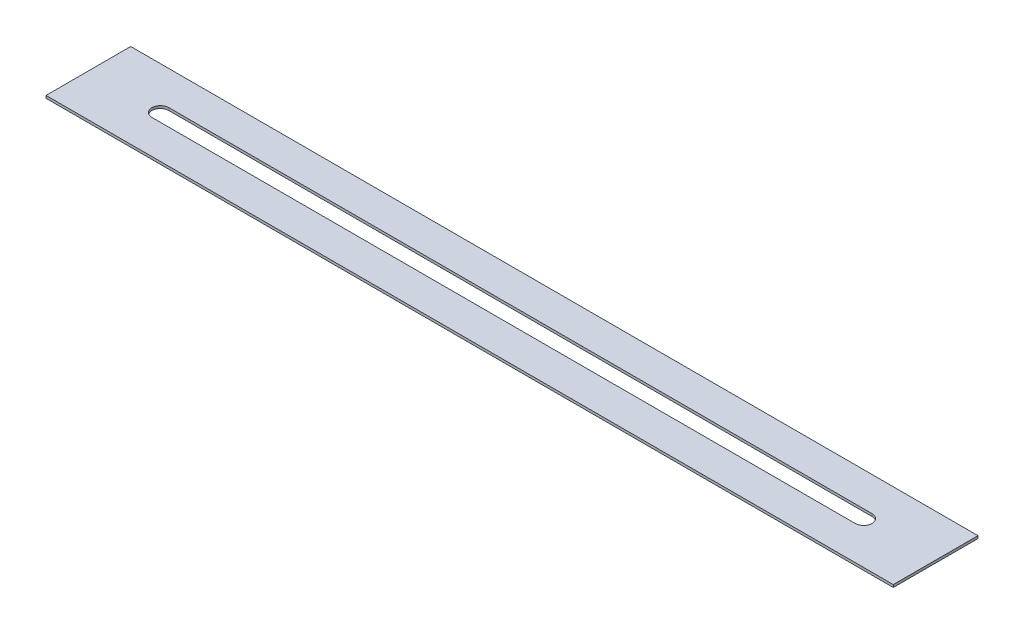
ISO-10303-21;
HEADER;
FILE_DESCRIPTION(('STEP AP214'),'2;1');
FILE_NAME('part.step','',(''),(''),'','','');
FILE_SCHEMA(('AUTOMOTIVE_DESIGN { 1 0 10303 214 1 1 1 1 }'));
ENDSEC;
DATA;
#1=APPLICATION_CONTEXT('core data for automotive mechanical design processes');
#2=APPLICATION_PROTOCOL_DEFINITION('international standard','automotive_design',2000,#1);
#3=PRODUCT_CONTEXT('',#1,'mechanical');
#4=PRODUCT('Part','Part','',(#3));
#5=PRODUCT_RELATED_PRODUCT_CATEGORY('part','',(#4));
#6=PRODUCT_DEFINITION_FORMATION('','',#4);
#7=PRODUCT_DEFINITION_CONTEXT('part definition',#1,'design');
#8=PRODUCT_DEFINITION('design','',#6,#7);
#9=PRODUCT_DEFINITION_SHAPE('','',#8);
#10=(LENGTH_UNIT() NAMED_UNIT(*) SI_UNIT(.MILLI.,.METRE.));
#11=(NAMED_UNIT(*) PLANE_ANGLE_UNIT() SI_UNIT($,.RADIAN.));
#12=(NAMED_UNIT(*) SI_UNIT($,.STERADIAN.) SOLID_ANGLE_UNIT());
#13=UNCERTAINTY_MEASURE_WITH_UNIT(LENGTH_MEASURE(1.E-05),#10,'distance_accuracy_value','');
#14=(GEOMETRIC_REPRESENTATION_CONTEXT(3) GLOBAL_UNCERTAINTY_ASSIGNED_CONTEXT((#13)) GLOBAL_UNIT_ASSIGNED_CONTEXT((#10,
#11,#12)) REPRESENTATION_CONTEXT('',''));
#15=CARTESIAN_POINT('',(0.,0.,0.));
#16=DIRECTION('',(0.,0.,1.));
#17=DIRECTION('',(1.,0.,0.));
#18=AXIS2_PLACEMENT_3D('',#15,#16,#17);
#19=CARTESIAN_POINT('',(0.,3.,0.));
#20=DIRECTION('',(0.,-1.,0.));
#21=DIRECTION('',(0.,0.,-1.));
#22=AXIS2_PLACEMENT_3D('',#19,#20,#21);
#23=PLANE('',#22);
#24=DIRECTION('',(0.,0.,-1.));
#25=VECTOR('',#24,1.);
#26=CARTESIAN_POINT('',(500.,3.,50.));
#27=LINE('',#26,#25);
#28=CARTESIAN_POINT('',(500.,3.,50.));
#29=VERTEX_POINT('',#28);
#30=CARTESIAN_POINT('',(500.,3.,-50.));
#31=VERTEX_POINT('',#30);
#32=EDGE_CURVE('E133',#29,#31,#27,.T.);
#33=ORIENTED_EDGE('',*,*,#32,.T.);
#34=DIRECTION('',(-1.,0.,0.));
#35=VECTOR('',#34,1.);
#36=CARTESIAN_POINT('',(-500.,3.,-50.));
#37=LINE('',#36,#35);
#38=CARTESIAN_POINT('',(-500.,3.,-50.));
#39=VERTEX_POINT('',#38);
#40=EDGE_CURVE('E136',#31,#39,#37,.T.);
#41=ORIENTED_EDGE('',*,*,#40,.T.);
#42=DIRECTION('',(0.,0.,1.));
#43=VECTOR('',#42,1.);
#44=CARTESIAN_POINT('',(-500.,3.,50.));
#45=LINE('',#44,#43);
#46=CARTESIAN_POINT('',(-500.,3.,50.));
#47=VERTEX_POINT('',#46);
#48=EDGE_CURVE('E139',#39,#47,#45,.T.);
#49=ORIENTED_EDGE('',*,*,#48,.T.);
#50=DIRECTION('',(1.,0.,0.));
#51=VECTOR('',#50,1.);
#52=CARTESIAN_POINT('',(-500.,3.,50.));
#53=LINE('',#52,#51);
#54=EDGE_CURVE('E141',#47,#29,#53,.T.);
#55=ORIENTED_EDGE('',*,*,#54,.T.);
#56=EDGE_LOOP('',(#33,#41,#49,#55));
#57=FACE_BOUND('',#56,.T.);
#58=CARTESIAN_POINT('',(-415.,3.,0.));
#59=DIRECTION('',(0.,1.,0.));
#60=DIRECTION('',(0.,0.,1.));
#61=AXIS2_PLACEMENT_3D('',#58,#59,#60);
#62=CIRCLE('',#61,9.99999999999997);
#63=CARTESIAN_POINT('',(-415.,3.,-10.));
#64=VERTEX_POINT('',#63);
#65=CARTESIAN_POINT('',(-415.,3.,9.99999999999992));
#66=VERTEX_POINT('',#65);
#67=EDGE_CURVE('E97',#64,#66,#62,.T.);
#68=ORIENTED_EDGE('',*,*,#67,.F.);
#69=DIRECTION('',(-1.,0.,0.));
#70=VECTOR('',#69,1.);
#71=CARTESIAN_POINT('',(-415.,3.,-10.));
#72=LINE('',#71,#70);
#73=CARTESIAN_POINT('',(415.,3.,-10.0000000000002));
#74=VERTEX_POINT('',#73);
#75=EDGE_CURVE('E119',#74,#64,#72,.T.);
#76=ORIENTED_EDGE('',*,*,#75,.F.);
#77=CARTESIAN_POINT('',(415.,3.,-2.01040783821196E-13));
#78=DIRECTION('',(0.,1.,0.));
#79=DIRECTION('',(0.,0.,1.));
#80=AXIS2_PLACEMENT_3D('',#77,#78,#79);
#81=CIRCLE('',#80,9.99999999999997);
#82=CARTESIAN_POINT('',(415.,3.,9.99999999999977));
#83=VERTEX_POINT('',#82);
#84=EDGE_CURVE('E117',#83,#74,#81,.T.);
#85=ORIENTED_EDGE('',*,*,#84,.F.);
#86=DIRECTION('',(1.,0.,0.));
#87=VECTOR('',#86,1.);
#88=CARTESIAN_POINT('',(-415.,3.,9.99999999999992));
#89=LINE('',#88,#87);
#90=EDGE_CURVE('E105',#66,#83,#89,.T.);
#91=ORIENTED_EDGE('',*,*,#90,.F.);
#92=EDGE_LOOP('',(#68,#76,#85,#91));
#93=FACE_BOUND('',#92,.T.);
#94=ADVANCED_FACE('F32',(#57,#93),#23,.F.);
#95=CARTESIAN_POINT('',(0.,0.,0.));
#96=DIRECTION('',(0.,-1.,0.));
#97=DIRECTION('',(0.,0.,-1.));
#98=AXIS2_PLACEMENT_3D('',#95,#96,#97);
#99=PLANE('',#98);
#100=DIRECTION('',(0.,0.,-1.));
#101=VECTOR('',#100,1.);
#102=CARTESIAN_POINT('',(500.,0.,50.));
#103=LINE('',#102,#101);
#104=CARTESIAN_POINT('',(500.,0.,50.));
#105=VERTEX_POINT('',#104);
#106=CARTESIAN_POINT('',(500.,0.,-50.));
#107=VERTEX_POINT('',#106);
#108=EDGE_CURVE('E113',#105,#107,#103,.T.);
#109=ORIENTED_EDGE('',*,*,#108,.F.);
#110=DIRECTION('',(1.,0.,0.));
#111=VECTOR('',#110,1.);
#112=CARTESIAN_POINT('',(-500.,0.,50.));
#113=LINE('',#112,#111);
#114=CARTESIAN_POINT('',(-500.,0.,50.));
#115=VERTEX_POINT('',#114);
#116=EDGE_CURVE('E137',#115,#105,#113,.T.);
#117=ORIENTED_EDGE('',*,*,#116,.F.);
#118=DIRECTION('',(0.,0.,1.));
#119=VECTOR('',#118,1.);
#120=CARTESIAN_POINT('',(-500.,0.,50.));
#121=LINE('',#120,#119);
#122=CARTESIAN_POINT('',(-500.,0.,-50.));
#123=VERTEX_POINT('',#122);
#124=EDGE_CURVE('E148',#123,#115,#121,.T.);
#125=ORIENTED_EDGE('',*,*,#124,.F.);
#126=DIRECTION('',(-1.,0.,0.));
#127=VECTOR('',#126,1.);
#128=CARTESIAN_POINT('',(-500.,0.,-50.));
#129=LINE('',#128,#127);
#130=EDGE_CURVE('E146',#107,#123,#129,.T.);
#131=ORIENTED_EDGE('',*,*,#130,.F.);
#132=EDGE_LOOP('',(#109,#117,#125,#131));
#133=FACE_BOUND('',#132,.T.);
#134=DIRECTION('',(-1.,0.,0.));
#135=VECTOR('',#134,1.);
#136=CARTESIAN_POINT('',(-415.,0.,-10.));
#137=LINE('',#136,#135);
#138=CARTESIAN_POINT('',(415.,0.,-10.0000000000002));
#139=VERTEX_POINT('',#138);
#140=CARTESIAN_POINT('',(-415.,0.,-10.));
#141=VERTEX_POINT('',#140);
#142=EDGE_CURVE('E106',#139,#141,#137,.T.);
#143=ORIENTED_EDGE('',*,*,#142,.T.);
#144=CARTESIAN_POINT('',(-415.,0.,0.));
#145=DIRECTION('',(0.,1.,0.));
#146=DIRECTION('',(0.,0.,1.));
#147=AXIS2_PLACEMENT_3D('',#144,#145,#146);
#148=CIRCLE('',#147,9.99999999999997);
#149=CARTESIAN_POINT('',(-415.,0.,9.99999999999992));
#150=VERTEX_POINT('',#149);
#151=EDGE_CURVE('E55',#141,#150,#148,.T.);
#152=ORIENTED_EDGE('',*,*,#151,.T.);
#153=DIRECTION('',(1.,0.,0.));
#154=VECTOR('',#153,1.);
#155=CARTESIAN_POINT('',(-415.,0.,9.99999999999992));
#156=LINE('',#155,#154);
#157=CARTESIAN_POINT('',(415.,0.,9.99999999999977));
#158=VERTEX_POINT('',#157);
#159=EDGE_CURVE('E112',#150,#158,#156,.T.);
#160=ORIENTED_EDGE('',*,*,#159,.T.);
#161=CARTESIAN_POINT('',(415.,0.,-2.01040783821196E-13));
#162=DIRECTION('',(0.,1.,0.));
#163=DIRECTION('',(0.,0.,1.));
#164=AXIS2_PLACEMENT_3D('',#161,#162,#163);
#165=CIRCLE('',#164,9.99999999999997);
#166=EDGE_CURVE('E125',#158,#139,#165,.T.);
#167=ORIENTED_EDGE('',*,*,#166,.T.);
#168=EDGE_LOOP('',(#143,#152,#160,#167));
#169=FACE_BOUND('',#168,.T.);
#170=ADVANCED_FACE('F166',(#133,#169),#99,.T.);
#171=CARTESIAN_POINT('',(500.,3.,50.));
#172=DIRECTION('',(-1.,0.,0.));
#173=DIRECTION('',(0.,0.,1.));
#174=AXIS2_PLACEMENT_3D('',#171,#172,#173);
#175=PLANE('',#174);
#176=ORIENTED_EDGE('',*,*,#108,.T.);
#177=DIRECTION('',(0.,-1.,0.));
#178=VECTOR('',#177,1.);
#179=CARTESIAN_POINT('',(500.,3.,-50.));
#180=LINE('',#179,#178);
#181=EDGE_CURVE('E11',#31,#107,#180,.T.);
#182=ORIENTED_EDGE('',*,*,#181,.F.);
#183=ORIENTED_EDGE('',*,*,#32,.F.);
#184=DIRECTION('',(0.,-1.,0.));
#185=VECTOR('',#184,1.);
#186=CARTESIAN_POINT('',(500.,3.,50.));
#187=LINE('',#186,#185);
#188=EDGE_CURVE('E143',#29,#105,#187,.T.);
#189=ORIENTED_EDGE('',*,*,#188,.T.);
#190=EDGE_LOOP('',(#176,#182,#183,#189));
#191=FACE_BOUND('',#190,.T.);
#192=ADVANCED_FACE('F34',(#191),#175,.F.);
#193=CARTESIAN_POINT('',(-500.,3.,-50.));
#194=DIRECTION('',(0.,0.,1.));
#195=DIRECTION('',(1.,0.,0.));
#196=AXIS2_PLACEMENT_3D('',#193,#194,#195);
#197=PLANE('',#196);
#198=ORIENTED_EDGE('',*,*,#130,.T.);
#199=DIRECTION('',(0.,-1.,0.));
#200=VECTOR('',#199,1.);
#201=CARTESIAN_POINT('',(-500.,3.,-50.));
#202=LINE('',#201,#200);
#203=EDGE_CURVE('E40',#39,#123,#202,.T.);
#204=ORIENTED_EDGE('',*,*,#203,.F.);
#205=ORIENTED_EDGE('',*,*,#40,.F.);
#206=ORIENTED_EDGE('',*,*,#181,.T.);
#207=EDGE_LOOP('',(#198,#204,#205,#206));
#208=FACE_BOUND('',#207,.T.);
#209=ADVANCED_FACE('F176',(#208),#197,.F.);
#210=CARTESIAN_POINT('',(-500.,3.,50.));
#211=DIRECTION('',(1.,0.,0.));
#212=DIRECTION('',(0.,0.,-1.));
#213=AXIS2_PLACEMENT_3D('',#210,#211,#212);
#214=PLANE('',#213);
#215=ORIENTED_EDGE('',*,*,#124,.T.);
#216=DIRECTION('',(0.,-1.,0.));
#217=VECTOR('',#216,1.);
#218=CARTESIAN_POINT('',(-500.,3.,50.));
#219=LINE('',#218,#217);
#220=EDGE_CURVE('E153',#47,#115,#219,.T.);
#221=ORIENTED_EDGE('',*,*,#220,.F.);
#222=ORIENTED_EDGE('',*,*,#48,.F.);
#223=ORIENTED_EDGE('',*,*,#203,.T.);
#224=EDGE_LOOP('',(#215,#221,#222,#223));
#225=FACE_BOUND('',#224,.T.);
#226=ADVANCED_FACE('F160',(#225),#214,.F.);
#227=CARTESIAN_POINT('',(-500.,3.,50.));
#228=DIRECTION('',(0.,0.,-1.));
#229=DIRECTION('',(-1.,0.,0.));
#230=AXIS2_PLACEMENT_3D('',#227,#228,#229);
#231=PLANE('',#230);
#232=ORIENTED_EDGE('',*,*,#116,.T.);
#233=ORIENTED_EDGE('',*,*,#188,.F.);
#234=ORIENTED_EDGE('',*,*,#54,.F.);
#235=ORIENTED_EDGE('',*,*,#220,.T.);
#236=EDGE_LOOP('',(#232,#233,#234,#235));
#237=FACE_BOUND('',#236,.T.);
#238=ADVANCED_FACE('F170',(#237),#231,.F.);
#239=CARTESIAN_POINT('',(-415.,3.,0.));
#240=DIRECTION('',(0.,-1.,0.));
#241=DIRECTION('',(0.,0.,-1.));
#242=AXIS2_PLACEMENT_3D('',#239,#240,#241);
#243=CYLINDRICAL_SURFACE('',#242,9.99999999999997);
#244=ORIENTED_EDGE('',*,*,#151,.F.);
#245=DIRECTION('',(0.,-1.,0.));
#246=VECTOR('',#245,1.);
#247=CARTESIAN_POINT('',(-415.,3.,-10.));
#248=LINE('',#247,#246);
#249=EDGE_CURVE('E101',#64,#141,#248,.T.);
#250=ORIENTED_EDGE('',*,*,#249,.F.);
#251=ORIENTED_EDGE('',*,*,#67,.T.);
#252=DIRECTION('',(0.,-1.,0.));
#253=VECTOR('',#252,1.);
#254=CARTESIAN_POINT('',(-415.,3.,9.99999999999992));
#255=LINE('',#254,#253);
#256=EDGE_CURVE('E100',#66,#150,#255,.T.);
#257=ORIENTED_EDGE('',*,*,#256,.T.);
#258=EDGE_LOOP('',(#244,#250,#251,#257));
#259=FACE_BOUND('',#258,.T.);
#260=ADVANCED_FACE('F99',(#259),#243,.F.);
#261=CARTESIAN_POINT('',(-415.,3.,9.99999999999992));
#262=DIRECTION('',(0.,0.,-1.));
#263=DIRECTION('',(-1.,0.,0.));
#264=AXIS2_PLACEMENT_3D('',#261,#262,#263);
#265=PLANE('',#264);
#266=ORIENTED_EDGE('',*,*,#159,.F.);
#267=ORIENTED_EDGE('',*,*,#256,.F.);
#268=ORIENTED_EDGE('',*,*,#90,.T.);
#269=DIRECTION('',(0.,-1.,0.));
#270=VECTOR('',#269,1.);
#271=CARTESIAN_POINT('',(415.,3.,9.99999999999977));
#272=LINE('',#271,#270);
#273=EDGE_CURVE('E114',#83,#158,#272,.T.);
#274=ORIENTED_EDGE('',*,*,#273,.T.);
#275=EDGE_LOOP('',(#266,#267,#268,#274));
#276=FACE_BOUND('',#275,.T.);
#277=ADVANCED_FACE('F109',(#276),#265,.T.);
#278=CARTESIAN_POINT('',(415.,3.,-2.01040783821196E-13));
#279=DIRECTION('',(0.,-1.,0.));
#280=DIRECTION('',(0.,0.,-1.));
#281=AXIS2_PLACEMENT_3D('',#278,#279,#280);
#282=CYLINDRICAL_SURFACE('',#281,9.99999999999997);
#283=ORIENTED_EDGE('',*,*,#166,.F.);
#284=ORIENTED_EDGE('',*,*,#273,.F.);
#285=ORIENTED_EDGE('',*,*,#84,.T.);
#286=DIRECTION('',(0.,-1.,0.));
#287=VECTOR('',#286,1.);
#288=CARTESIAN_POINT('',(415.,3.,-10.0000000000002));
#289=LINE('',#288,#287);
#290=EDGE_CURVE('E47',#74,#139,#289,.T.);
#291=ORIENTED_EDGE('',*,*,#290,.T.);
#292=EDGE_LOOP('',(#283,#284,#285,#291));
#293=FACE_BOUND('',#292,.T.);
#294=ADVANCED_FACE('F199',(#293),#282,.F.);
#295=CARTESIAN_POINT('',(-415.,3.,-10.));
#296=DIRECTION('',(0.,0.,1.));
#297=DIRECTION('',(1.,0.,0.));
#298=AXIS2_PLACEMENT_3D('',#295,#296,#297);
#299=PLANE('',#298);
#300=ORIENTED_EDGE('',*,*,#142,.F.);
#301=ORIENTED_EDGE('',*,*,#290,.F.);
#302=ORIENTED_EDGE('',*,*,#75,.T.);
#303=ORIENTED_EDGE('',*,*,#249,.T.);
#304=EDGE_LOOP('',(#300,#301,#302,#303));
#305=FACE_BOUND('',#304,.T.);
#306=ADVANCED_FACE('F203',(#305),#299,.T.);
#307=CLOSED_SHELL('',(#94,#170,#192,#209,#226,#238,#260,#277,#294,#306));
#308=MANIFOLD_SOLID_BREP('B2',#307);
#309=ADVANCED_BREP_SHAPE_REPRESENTATION('',(#18,#308),#14);
#310=SHAPE_DEFINITION_REPRESENTATION(#9,#309);
ENDSEC;
END-ISO-10303-21;
